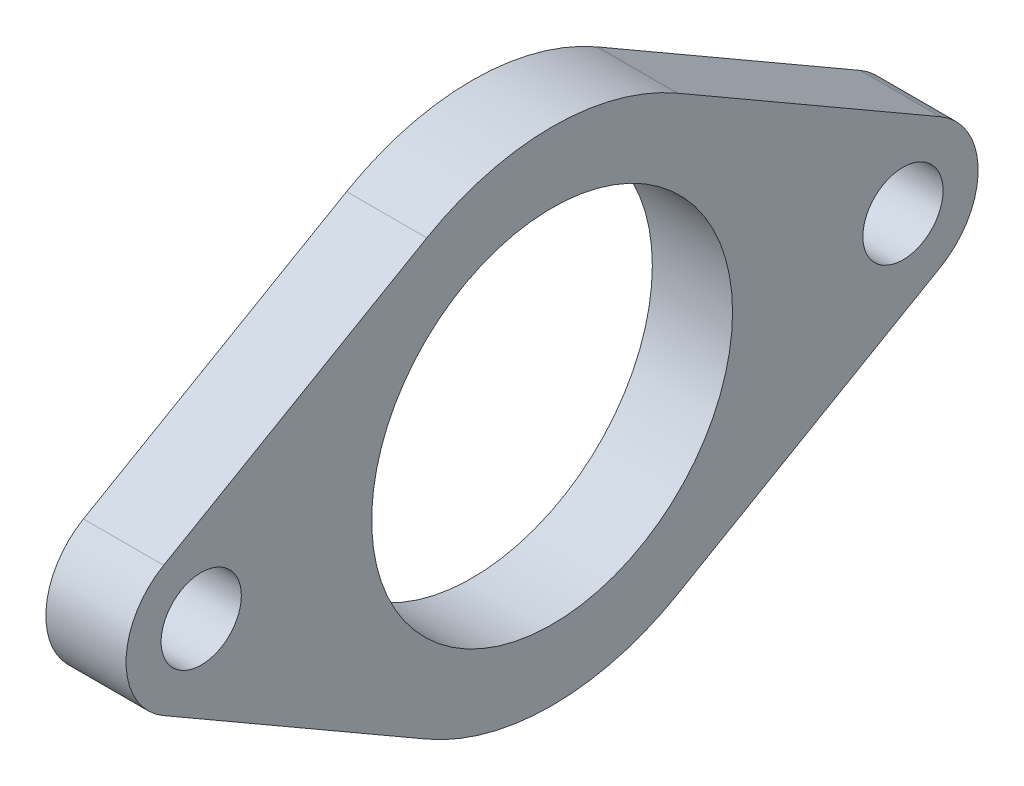
ISO-10303-21;
HEADER;
FILE_DESCRIPTION(('STEP AP214'),'2;1');
FILE_NAME('part.step','',(''),(''),'','','');
FILE_SCHEMA(('AUTOMOTIVE_DESIGN { 1 0 10303 214 1 1 1 1 }'));
ENDSEC;
DATA;
#1=APPLICATION_CONTEXT('core data for automotive mechanical design processes');
#2=APPLICATION_PROTOCOL_DEFINITION('international standard','automotive_design',2000,#1);
#3=PRODUCT_CONTEXT('',#1,'mechanical');
#4=PRODUCT('Part','Part','',(#3));
#5=PRODUCT_RELATED_PRODUCT_CATEGORY('part','',(#4));
#6=PRODUCT_DEFINITION_FORMATION('','',#4);
#7=PRODUCT_DEFINITION_CONTEXT('part definition',#1,'design');
#8=PRODUCT_DEFINITION('design','',#6,#7);
#9=PRODUCT_DEFINITION_SHAPE('','',#8);
#10=(LENGTH_UNIT() NAMED_UNIT(*) SI_UNIT(.MILLI.,.METRE.));
#11=(NAMED_UNIT(*) PLANE_ANGLE_UNIT() SI_UNIT($,.RADIAN.));
#12=(NAMED_UNIT(*) SI_UNIT($,.STERADIAN.) SOLID_ANGLE_UNIT());
#13=UNCERTAINTY_MEASURE_WITH_UNIT(LENGTH_MEASURE(1.E-05),#10,'distance_accuracy_value','');
#14=(GEOMETRIC_REPRESENTATION_CONTEXT(3) GLOBAL_UNCERTAINTY_ASSIGNED_CONTEXT((#13)) GLOBAL_UNIT_ASSIGNED_CONTEXT((#10,
#11,#12)) REPRESENTATION_CONTEXT('',''));
#15=CARTESIAN_POINT('',(0.,0.,0.));
#16=DIRECTION('',(0.,0.,1.));
#17=DIRECTION('',(1.,0.,0.));
#18=AXIS2_PLACEMENT_3D('',#15,#16,#17);
#19=CARTESIAN_POINT('',(8.,-21.650635094611,-12.5));
#20=DIRECTION('',(0.,0.866025403784438,0.500000000000001));
#21=DIRECTION('',(0.,-0.500000000000001,0.866025403784438));
#22=AXIS2_PLACEMENT_3D('',#19,#20,#21);
#23=PLANE('',#22);
#24=DIRECTION('',(0.,0.500000000000001,-0.866025403784438));
#25=VECTOR('',#24,1.);
#26=CARTESIAN_POINT('',(0.,-21.650635094611,-12.5));
#27=LINE('',#26,#25);
#28=CARTESIAN_POINT('',(0.,-21.650635094611,-12.5));
#29=VERTEX_POINT('',#28);
#30=CARTESIAN_POINT('',(0.,-6.49519052838328,-38.75));
#31=VERTEX_POINT('',#30);
#32=EDGE_CURVE('E137',#29,#31,#27,.T.);
#33=ORIENTED_EDGE('',*,*,#32,.T.);
#34=DIRECTION('',(-1.,0.,0.));
#35=VECTOR('',#34,1.);
#36=CARTESIAN_POINT('',(8.,-6.49519052838328,-38.75));
#37=LINE('',#36,#35);
#38=CARTESIAN_POINT('',(8.,-6.49519052838328,-38.75));
#39=VERTEX_POINT('',#38);
#40=EDGE_CURVE('E11',#39,#31,#37,.T.);
#41=ORIENTED_EDGE('',*,*,#40,.F.);
#42=DIRECTION('',(0.,0.500000000000001,-0.866025403784438));
#43=VECTOR('',#42,1.);
#44=CARTESIAN_POINT('',(8.,-21.650635094611,-12.5));
#45=LINE('',#44,#43);
#46=CARTESIAN_POINT('',(8.,-21.650635094611,-12.5));
#47=VERTEX_POINT('',#46);
#48=EDGE_CURVE('E165',#47,#39,#45,.T.);
#49=ORIENTED_EDGE('',*,*,#48,.F.);
#50=DIRECTION('',(-1.,0.,0.));
#51=VECTOR('',#50,1.);
#52=CARTESIAN_POINT('',(8.,-21.650635094611,-12.5));
#53=LINE('',#52,#51);
#54=EDGE_CURVE('E136',#47,#29,#53,.T.);
#55=ORIENTED_EDGE('',*,*,#54,.T.);
#56=EDGE_LOOP('',(#33,#41,#49,#55));
#57=FACE_BOUND('',#56,.T.);
#58=ADVANCED_FACE('F33',(#57),#23,.F.);
#59=CARTESIAN_POINT('',(8.,0.,-35.));
#60=DIRECTION('',(-1.,0.,0.));
#61=DIRECTION('',(0.,0.,1.));
#62=AXIS2_PLACEMENT_3D('',#59,#60,#61);
#63=CYLINDRICAL_SURFACE('',#62,7.5);
#64=CARTESIAN_POINT('',(0.,0.,-35.));
#65=DIRECTION('',(1.,0.,0.));
#66=DIRECTION('',(0.,0.,-1.));
#67=AXIS2_PLACEMENT_3D('',#64,#65,#66);
#68=CIRCLE('',#67,7.5);
#69=CARTESIAN_POINT('',(0.,6.4951905283833,-38.75));
#70=VERTEX_POINT('',#69);
#71=EDGE_CURVE('E140',#31,#70,#68,.T.);
#72=ORIENTED_EDGE('',*,*,#71,.T.);
#73=DIRECTION('',(-1.,0.,0.));
#74=VECTOR('',#73,1.);
#75=CARTESIAN_POINT('',(8.,6.4951905283833,-38.75));
#76=LINE('',#75,#74);
#77=CARTESIAN_POINT('',(8.,6.4951905283833,-38.75));
#78=VERTEX_POINT('',#77);
#79=EDGE_CURVE('E41',#78,#70,#76,.T.);
#80=ORIENTED_EDGE('',*,*,#79,.F.);
#81=CARTESIAN_POINT('',(8.,0.,-35.));
#82=DIRECTION('',(1.,0.,0.));
#83=DIRECTION('',(0.,0.,-1.));
#84=AXIS2_PLACEMENT_3D('',#81,#82,#83);
#85=CIRCLE('',#84,7.5);
#86=EDGE_CURVE('E88',#39,#78,#85,.T.);
#87=ORIENTED_EDGE('',*,*,#86,.F.);
#88=ORIENTED_EDGE('',*,*,#40,.T.);
#89=EDGE_LOOP('',(#72,#80,#87,#88));
#90=FACE_BOUND('',#89,.T.);
#91=ADVANCED_FACE('F178',(#90),#63,.T.);
#92=CARTESIAN_POINT('',(8.,21.650635094611,-12.5));
#93=DIRECTION('',(0.,0.866025403784439,-0.5));
#94=DIRECTION('',(0.,0.5,0.866025403784439));
#95=AXIS2_PLACEMENT_3D('',#92,#93,#94);
#96=PLANE('',#95);
#97=DIRECTION('',(0.,-0.5,-0.866025403784439));
#98=VECTOR('',#97,1.);
#99=CARTESIAN_POINT('',(0.,21.650635094611,-12.5));
#100=LINE('',#99,#98);
#101=CARTESIAN_POINT('',(0.,21.650635094611,-12.5));
#102=VERTEX_POINT('',#101);
#103=EDGE_CURVE('E143',#102,#70,#100,.T.);
#104=ORIENTED_EDGE('',*,*,#103,.F.);
#105=DIRECTION('',(-1.,0.,0.));
#106=VECTOR('',#105,1.);
#107=CARTESIAN_POINT('',(8.,21.650635094611,-12.5));
#108=LINE('',#107,#106);
#109=CARTESIAN_POINT('',(8.,21.650635094611,-12.5));
#110=VERTEX_POINT('',#109);
#111=EDGE_CURVE('E171',#110,#102,#108,.T.);
#112=ORIENTED_EDGE('',*,*,#111,.F.);
#113=DIRECTION('',(0.,-0.5,-0.866025403784439));
#114=VECTOR('',#113,1.);
#115=CARTESIAN_POINT('',(8.,21.650635094611,-12.5));
#116=LINE('',#115,#114);
#117=EDGE_CURVE('E177',#110,#78,#116,.T.);
#118=ORIENTED_EDGE('',*,*,#117,.T.);
#119=ORIENTED_EDGE('',*,*,#79,.T.);
#120=EDGE_LOOP('',(#104,#112,#118,#119));
#121=FACE_BOUND('',#120,.T.);
#122=ADVANCED_FACE('F175',(#121),#96,.T.);
#123=CARTESIAN_POINT('',(8.,0.,0.));
#124=DIRECTION('',(-1.,0.,0.));
#125=DIRECTION('',(0.,0.,1.));
#126=AXIS2_PLACEMENT_3D('',#123,#124,#125);
#127=CYLINDRICAL_SURFACE('',#126,25.);
#128=CARTESIAN_POINT('',(0.,0.,0.));
#129=DIRECTION('',(1.,0.,0.));
#130=DIRECTION('',(0.,0.,-1.));
#131=AXIS2_PLACEMENT_3D('',#128,#129,#130);
#132=CIRCLE('',#131,25.);
#133=CARTESIAN_POINT('',(0.,21.650635094611,12.5));
#134=VERTEX_POINT('',#133);
#135=EDGE_CURVE('E146',#102,#134,#132,.T.);
#136=ORIENTED_EDGE('',*,*,#135,.T.);
#137=DIRECTION('',(-1.,0.,0.));
#138=VECTOR('',#137,1.);
#139=CARTESIAN_POINT('',(8.,21.650635094611,12.5));
#140=LINE('',#139,#138);
#141=CARTESIAN_POINT('',(8.,21.650635094611,12.5));
#142=VERTEX_POINT('',#141);
#143=EDGE_CURVE('E169',#142,#134,#140,.T.);
#144=ORIENTED_EDGE('',*,*,#143,.F.);
#145=CARTESIAN_POINT('',(8.,0.,0.));
#146=DIRECTION('',(1.,0.,0.));
#147=DIRECTION('',(0.,0.,-1.));
#148=AXIS2_PLACEMENT_3D('',#145,#146,#147);
#149=CIRCLE('',#148,25.);
#150=EDGE_CURVE('E190',#110,#142,#149,.T.);
#151=ORIENTED_EDGE('',*,*,#150,.F.);
#152=ORIENTED_EDGE('',*,*,#111,.T.);
#153=EDGE_LOOP('',(#136,#144,#151,#152));
#154=FACE_BOUND('',#153,.T.);
#155=ADVANCED_FACE('F188',(#154),#127,.T.);
#156=CARTESIAN_POINT('',(8.,21.650635094611,12.5));
#157=DIRECTION('',(0.,0.866025403784439,0.5));
#158=DIRECTION('',(0.,-0.5,0.866025403784439));
#159=AXIS2_PLACEMENT_3D('',#156,#157,#158);
#160=PLANE('',#159);
#161=DIRECTION('',(0.,0.5,-0.866025403784439));
#162=VECTOR('',#161,1.);
#163=CARTESIAN_POINT('',(0.,21.650635094611,12.5));
#164=LINE('',#163,#162);
#165=CARTESIAN_POINT('',(0.,6.49519052838329,38.75));
#166=VERTEX_POINT('',#165);
#167=EDGE_CURVE('E149',#166,#134,#164,.T.);
#168=ORIENTED_EDGE('',*,*,#167,.F.);
#169=DIRECTION('',(-1.,0.,0.));
#170=VECTOR('',#169,1.);
#171=CARTESIAN_POINT('',(8.,6.49519052838329,38.75));
#172=LINE('',#171,#170);
#173=CARTESIAN_POINT('',(8.,6.49519052838329,38.75));
#174=VERTEX_POINT('',#173);
#175=EDGE_CURVE('E120',#174,#166,#172,.T.);
#176=ORIENTED_EDGE('',*,*,#175,.F.);
#177=DIRECTION('',(0.,0.5,-0.866025403784439));
#178=VECTOR('',#177,1.);
#179=CARTESIAN_POINT('',(8.,21.650635094611,12.5));
#180=LINE('',#179,#178);
#181=EDGE_CURVE('E109',#174,#142,#180,.T.);
#182=ORIENTED_EDGE('',*,*,#181,.T.);
#183=ORIENTED_EDGE('',*,*,#143,.T.);
#184=EDGE_LOOP('',(#168,#176,#182,#183));
#185=FACE_BOUND('',#184,.T.);
#186=ADVANCED_FACE('F196',(#185),#160,.T.);
#187=CARTESIAN_POINT('',(8.,0.,35.));
#188=DIRECTION('',(-1.,0.,0.));
#189=DIRECTION('',(0.,0.,1.));
#190=AXIS2_PLACEMENT_3D('',#187,#188,#189);
#191=CYLINDRICAL_SURFACE('',#190,7.5);
#192=CARTESIAN_POINT('',(0.,0.,35.));
#193=DIRECTION('',(1.,0.,0.));
#194=DIRECTION('',(0.,0.,-1.));
#195=AXIS2_PLACEMENT_3D('',#192,#193,#194);
#196=CIRCLE('',#195,7.5);
#197=CARTESIAN_POINT('',(0.,-6.49519052838329,38.75));
#198=VERTEX_POINT('',#197);
#199=EDGE_CURVE('E116',#166,#198,#196,.T.);
#200=ORIENTED_EDGE('',*,*,#199,.T.);
#201=DIRECTION('',(-1.,0.,0.));
#202=VECTOR('',#201,1.);
#203=CARTESIAN_POINT('',(8.,-6.49519052838329,38.75));
#204=LINE('',#203,#202);
#205=CARTESIAN_POINT('',(8.,-6.49519052838329,38.75));
#206=VERTEX_POINT('',#205);
#207=EDGE_CURVE('E113',#206,#198,#204,.T.);
#208=ORIENTED_EDGE('',*,*,#207,.F.);
#209=CARTESIAN_POINT('',(8.,0.,35.));
#210=DIRECTION('',(1.,0.,0.));
#211=DIRECTION('',(0.,0.,-1.));
#212=AXIS2_PLACEMENT_3D('',#209,#210,#211);
#213=CIRCLE('',#212,7.5);
#214=EDGE_CURVE('E102',#174,#206,#213,.T.);
#215=ORIENTED_EDGE('',*,*,#214,.F.);
#216=ORIENTED_EDGE('',*,*,#175,.T.);
#217=EDGE_LOOP('',(#200,#208,#215,#216));
#218=FACE_BOUND('',#217,.T.);
#219=ADVANCED_FACE('F114',(#218),#191,.T.);
#220=CARTESIAN_POINT('',(8.,-21.650635094611,12.5));
#221=DIRECTION('',(0.,-0.866025403784439,0.5));
#222=DIRECTION('',(0.,-0.5,-0.866025403784439));
#223=AXIS2_PLACEMENT_3D('',#220,#221,#222);
#224=PLANE('',#223);
#225=DIRECTION('',(0.,0.5,0.866025403784439));
#226=VECTOR('',#225,1.);
#227=CARTESIAN_POINT('',(0.,-21.650635094611,12.5));
#228=LINE('',#227,#226);
#229=CARTESIAN_POINT('',(0.,-21.650635094611,12.5));
#230=VERTEX_POINT('',#229);
#231=EDGE_CURVE('E153',#230,#198,#228,.T.);
#232=ORIENTED_EDGE('',*,*,#231,.F.);
#233=DIRECTION('',(-1.,0.,0.));
#234=VECTOR('',#233,1.);
#235=CARTESIAN_POINT('',(8.,-21.650635094611,12.5));
#236=LINE('',#235,#234);
#237=CARTESIAN_POINT('',(8.,-21.650635094611,12.5));
#238=VERTEX_POINT('',#237);
#239=EDGE_CURVE('E77',#238,#230,#236,.T.);
#240=ORIENTED_EDGE('',*,*,#239,.F.);
#241=DIRECTION('',(0.,0.5,0.866025403784439));
#242=VECTOR('',#241,1.);
#243=CARTESIAN_POINT('',(8.,-21.650635094611,12.5));
#244=LINE('',#243,#242);
#245=EDGE_CURVE('E107',#238,#206,#244,.T.);
#246=ORIENTED_EDGE('',*,*,#245,.T.);
#247=ORIENTED_EDGE('',*,*,#207,.T.);
#248=EDGE_LOOP('',(#232,#240,#246,#247));
#249=FACE_BOUND('',#248,.T.);
#250=ADVANCED_FACE('F122',(#249),#224,.T.);
#251=CARTESIAN_POINT('',(8.,0.,35.));
#252=DIRECTION('',(-1.,0.,0.));
#253=DIRECTION('',(0.,0.,1.));
#254=AXIS2_PLACEMENT_3D('',#251,#252,#253);
#255=CYLINDRICAL_SURFACE('',#254,4.);
#256=CARTESIAN_POINT('',(8.,0.,35.));
#257=DIRECTION('',(1.,0.,0.));
#258=DIRECTION('',(0.,0.,-1.));
#259=AXIS2_PLACEMENT_3D('',#256,#257,#258);
#260=CIRCLE('',#259,4.);
#261=CARTESIAN_POINT('',(8.,0.,31.));
#262=VERTEX_POINT('',#261);
#263=EDGE_CURVE('E130',#262,#262,#260,.T.);
#264=ORIENTED_EDGE('',*,*,#263,.T.);
#265=EDGE_LOOP('',(#264));
#266=FACE_BOUND('',#265,.T.);
#267=CARTESIAN_POINT('',(0.,0.,35.));
#268=DIRECTION('',(1.,0.,0.));
#269=DIRECTION('',(0.,0.,-1.));
#270=AXIS2_PLACEMENT_3D('',#267,#268,#269);
#271=CIRCLE('',#270,4.);
#272=CARTESIAN_POINT('',(0.,0.,31.));
#273=VERTEX_POINT('',#272);
#274=EDGE_CURVE('E159',#273,#273,#271,.T.);
#275=ORIENTED_EDGE('',*,*,#274,.F.);
#276=EDGE_LOOP('',(#275));
#277=FACE_BOUND('',#276,.T.);
#278=ADVANCED_FACE('F210',(#266,#277),#255,.F.);
#279=CARTESIAN_POINT('',(8.,0.,0.));
#280=DIRECTION('',(-1.,0.,0.));
#281=DIRECTION('',(0.,0.,1.));
#282=AXIS2_PLACEMENT_3D('',#279,#280,#281);
#283=CYLINDRICAL_SURFACE('',#282,18.);
#284=CARTESIAN_POINT('',(8.,0.,0.));
#285=DIRECTION('',(1.,0.,0.));
#286=DIRECTION('',(0.,0.,-1.));
#287=AXIS2_PLACEMENT_3D('',#284,#285,#286);
#288=CIRCLE('',#287,18.);
#289=CARTESIAN_POINT('',(8.,0.,-18.));
#290=VERTEX_POINT('',#289);
#291=EDGE_CURVE('E124',#290,#290,#288,.T.);
#292=ORIENTED_EDGE('',*,*,#291,.T.);
#293=EDGE_LOOP('',(#292));
#294=FACE_BOUND('',#293,.T.);
#295=CARTESIAN_POINT('',(0.,0.,0.));
#296=DIRECTION('',(1.,0.,0.));
#297=DIRECTION('',(0.,0.,-1.));
#298=AXIS2_PLACEMENT_3D('',#295,#296,#297);
#299=CIRCLE('',#298,18.);
#300=CARTESIAN_POINT('',(0.,0.,-18.));
#301=VERTEX_POINT('',#300);
#302=EDGE_CURVE('E156',#301,#301,#299,.T.);
#303=ORIENTED_EDGE('',*,*,#302,.F.);
#304=EDGE_LOOP('',(#303));
#305=FACE_BOUND('',#304,.T.);
#306=ADVANCED_FACE('F202',(#294,#305),#283,.F.);
#307=CARTESIAN_POINT('',(8.,0.,0.));
#308=DIRECTION('',(-1.,0.,0.));
#309=DIRECTION('',(0.,0.,1.));
#310=AXIS2_PLACEMENT_3D('',#307,#308,#309);
#311=CYLINDRICAL_SURFACE('',#310,25.);
#312=CARTESIAN_POINT('',(0.,0.,0.));
#313=DIRECTION('',(1.,0.,0.));
#314=DIRECTION('',(0.,0.,-1.));
#315=AXIS2_PLACEMENT_3D('',#312,#313,#314);
#316=CIRCLE('',#315,25.);
#317=EDGE_CURVE('E80',#230,#29,#316,.T.);
#318=ORIENTED_EDGE('',*,*,#317,.T.);
#319=ORIENTED_EDGE('',*,*,#54,.F.);
#320=CARTESIAN_POINT('',(8.,0.,0.));
#321=DIRECTION('',(1.,0.,0.));
#322=DIRECTION('',(0.,0.,-1.));
#323=AXIS2_PLACEMENT_3D('',#320,#321,#322);
#324=CIRCLE('',#323,25.);
#325=EDGE_CURVE('E49',#238,#47,#324,.T.);
#326=ORIENTED_EDGE('',*,*,#325,.F.);
#327=ORIENTED_EDGE('',*,*,#239,.T.);
#328=EDGE_LOOP('',(#318,#319,#326,#327));
#329=FACE_BOUND('',#328,.T.);
#330=ADVANCED_FACE('F199',(#329),#311,.T.);
#331=CARTESIAN_POINT('',(8.,0.,-35.));
#332=DIRECTION('',(-1.,0.,0.));
#333=DIRECTION('',(0.,0.,1.));
#334=AXIS2_PLACEMENT_3D('',#331,#332,#333);
#335=CYLINDRICAL_SURFACE('',#334,4.00000000000001);
#336=CARTESIAN_POINT('',(8.,0.,-35.));
#337=DIRECTION('',(1.,0.,0.));
#338=DIRECTION('',(0.,0.,-1.));
#339=AXIS2_PLACEMENT_3D('',#336,#337,#338);
#340=CIRCLE('',#339,4.00000000000001);
#341=CARTESIAN_POINT('',(8.,0.,-39.));
#342=VERTEX_POINT('',#341);
#343=EDGE_CURVE('E133',#342,#342,#340,.T.);
#344=ORIENTED_EDGE('',*,*,#343,.T.);
#345=EDGE_LOOP('',(#344));
#346=FACE_BOUND('',#345,.T.);
#347=CARTESIAN_POINT('',(0.,0.,-35.));
#348=DIRECTION('',(1.,0.,0.));
#349=DIRECTION('',(0.,0.,-1.));
#350=AXIS2_PLACEMENT_3D('',#347,#348,#349);
#351=CIRCLE('',#350,4.00000000000001);
#352=CARTESIAN_POINT('',(0.,0.,-39.));
#353=VERTEX_POINT('',#352);
#354=EDGE_CURVE('E162',#353,#353,#351,.T.);
#355=ORIENTED_EDGE('',*,*,#354,.F.);
#356=EDGE_LOOP('',(#355));
#357=FACE_BOUND('',#356,.T.);
#358=ADVANCED_FACE('F201',(#346,#357),#335,.F.);
#359=CARTESIAN_POINT('',(8.,0.,0.));
#360=DIRECTION('',(1.,0.,0.));
#361=DIRECTION('',(0.,0.,-1.));
#362=AXIS2_PLACEMENT_3D('',#359,#360,#361);
#363=PLANE('',#362);
#364=ORIENTED_EDGE('',*,*,#48,.T.);
#365=ORIENTED_EDGE('',*,*,#86,.T.);
#366=ORIENTED_EDGE('',*,*,#117,.F.);
#367=ORIENTED_EDGE('',*,*,#150,.T.);
#368=ORIENTED_EDGE('',*,*,#181,.F.);
#369=ORIENTED_EDGE('',*,*,#214,.T.);
#370=ORIENTED_EDGE('',*,*,#245,.F.);
#371=ORIENTED_EDGE('',*,*,#325,.T.);
#372=EDGE_LOOP('',(#364,#365,#366,#367,#368,#369,#370,#371));
#373=FACE_BOUND('',#372,.T.);
#374=ORIENTED_EDGE('',*,*,#291,.F.);
#375=EDGE_LOOP('',(#374));
#376=FACE_BOUND('',#375,.T.);
#377=ORIENTED_EDGE('',*,*,#263,.F.);
#378=EDGE_LOOP('',(#377));
#379=FACE_BOUND('',#378,.T.);
#380=ORIENTED_EDGE('',*,*,#343,.F.);
#381=EDGE_LOOP('',(#380));
#382=FACE_BOUND('',#381,.T.);
#383=ADVANCED_FACE('F104',(#373,#376,#379,#382),#363,.T.);
#384=CARTESIAN_POINT('',(0.,0.,0.));
#385=DIRECTION('',(1.,0.,0.));
#386=DIRECTION('',(0.,0.,-1.));
#387=AXIS2_PLACEMENT_3D('',#384,#385,#386);
#388=PLANE('',#387);
#389=ORIENTED_EDGE('',*,*,#32,.F.);
#390=ORIENTED_EDGE('',*,*,#317,.F.);
#391=ORIENTED_EDGE('',*,*,#231,.T.);
#392=ORIENTED_EDGE('',*,*,#199,.F.);
#393=ORIENTED_EDGE('',*,*,#167,.T.);
#394=ORIENTED_EDGE('',*,*,#135,.F.);
#395=ORIENTED_EDGE('',*,*,#103,.T.);
#396=ORIENTED_EDGE('',*,*,#71,.F.);
#397=EDGE_LOOP('',(#389,#390,#391,#392,#393,#394,#395,#396));
#398=FACE_BOUND('',#397,.T.);
#399=ORIENTED_EDGE('',*,*,#302,.T.);
#400=EDGE_LOOP('',(#399));
#401=FACE_BOUND('',#400,.T.);
#402=ORIENTED_EDGE('',*,*,#274,.T.);
#403=EDGE_LOOP('',(#402));
#404=FACE_BOUND('',#403,.T.);
#405=ORIENTED_EDGE('',*,*,#354,.T.);
#406=EDGE_LOOP('',(#405));
#407=FACE_BOUND('',#406,.T.);
#408=ADVANCED_FACE('F183',(#398,#401,#404,#407),#388,.F.);
#409=CLOSED_SHELL('',(#58,#91,#122,#155,#186,#219,#250,#278,#306,#330,#358,#383,#408));
#410=MANIFOLD_SOLID_BREP('B2',#409);
#411=ADVANCED_BREP_SHAPE_REPRESENTATION('',(#18,#410),#14);
#412=SHAPE_DEFINITION_REPRESENTATION(#9,#411);
ENDSEC;
END-ISO-10303-21;
